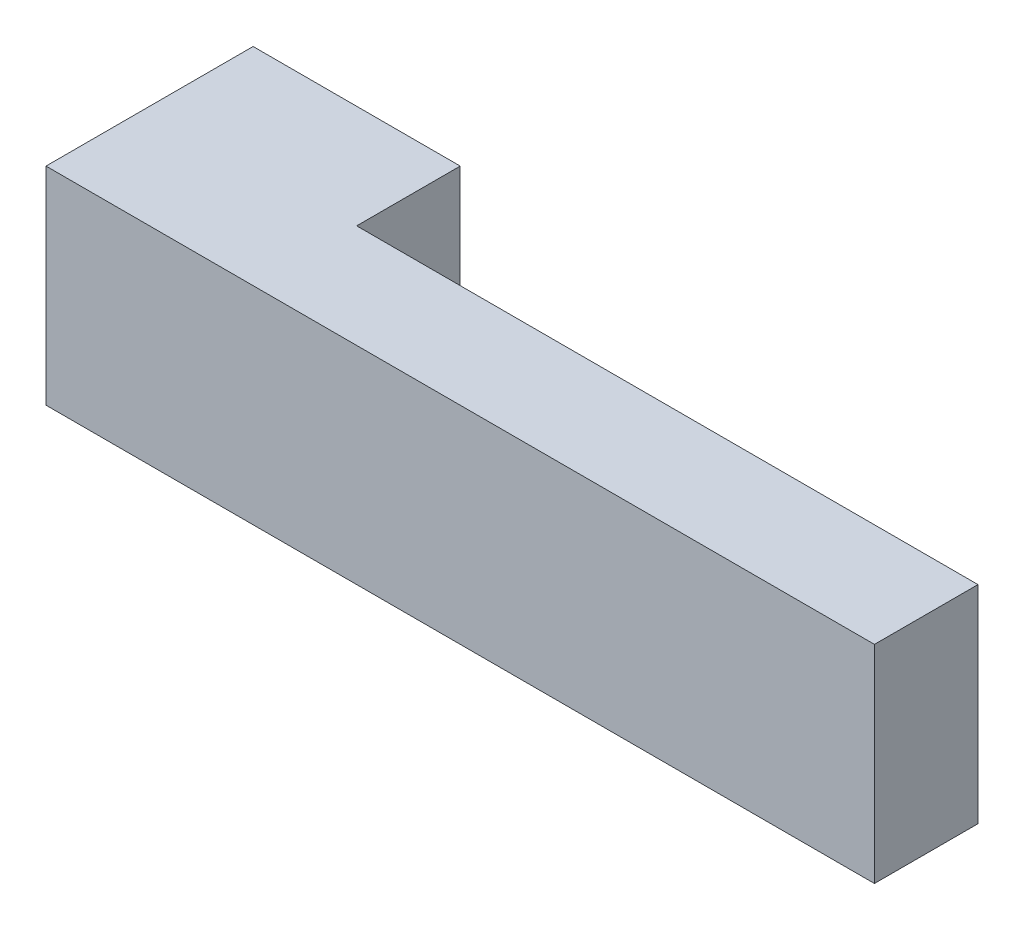
ISO-10303-21;
HEADER;
FILE_DESCRIPTION(('STEP AP214'),'2;1');
FILE_NAME('part.step','',(''),(''),'','','');
FILE_SCHEMA(('AUTOMOTIVE_DESIGN { 1 0 10303 214 1 1 1 1 }'));
ENDSEC;
DATA;
#1=APPLICATION_CONTEXT('core data for automotive mechanical design processes');
#2=APPLICATION_PROTOCOL_DEFINITION('international standard','automotive_design',2000,#1);
#3=PRODUCT_CONTEXT('',#1,'mechanical');
#4=PRODUCT('Part','Part','',(#3));
#5=PRODUCT_RELATED_PRODUCT_CATEGORY('part','',(#4));
#6=PRODUCT_DEFINITION_FORMATION('','',#4);
#7=PRODUCT_DEFINITION_CONTEXT('part definition',#1,'design');
#8=PRODUCT_DEFINITION('design','',#6,#7);
#9=PRODUCT_DEFINITION_SHAPE('','',#8);
#10=(LENGTH_UNIT() NAMED_UNIT(*) SI_UNIT(.MILLI.,.METRE.));
#11=(NAMED_UNIT(*) PLANE_ANGLE_UNIT() SI_UNIT($,.RADIAN.));
#12=(NAMED_UNIT(*) SI_UNIT($,.STERADIAN.) SOLID_ANGLE_UNIT());
#13=UNCERTAINTY_MEASURE_WITH_UNIT(LENGTH_MEASURE(1.E-05),#10,'distance_accuracy_value','');
#14=(GEOMETRIC_REPRESENTATION_CONTEXT(3) GLOBAL_UNCERTAINTY_ASSIGNED_CONTEXT((#13)) GLOBAL_UNIT_ASSIGNED_CONTEXT((#10,
#11,#12)) REPRESENTATION_CONTEXT('',''));
#15=CARTESIAN_POINT('',(0.,0.,0.));
#16=DIRECTION('',(0.,0.,1.));
#17=DIRECTION('',(1.,0.,0.));
#18=AXIS2_PLACEMENT_3D('',#15,#16,#17);
#19=CARTESIAN_POINT('',(80.,20.,20.));
#20=DIRECTION('',(-1.,0.,0.));
#21=DIRECTION('',(0.,0.,1.));
#22=AXIS2_PLACEMENT_3D('',#19,#20,#21);
#23=PLANE('',#22);
#24=DIRECTION('',(0.,0.,-1.));
#25=VECTOR('',#24,1.);
#26=CARTESIAN_POINT('',(80.,0.,20.));
#27=LINE('',#26,#25);
#28=CARTESIAN_POINT('',(80.,0.,20.));
#29=VERTEX_POINT('',#28);
#30=CARTESIAN_POINT('',(80.,0.,9.99999999999999));
#31=VERTEX_POINT('',#30);
#32=EDGE_CURVE('E128',#29,#31,#27,.T.);
#33=ORIENTED_EDGE('',*,*,#32,.T.);
#34=DIRECTION('',(0.,-1.,0.));
#35=VECTOR('',#34,1.);
#36=CARTESIAN_POINT('',(80.,20.,9.99999999999999));
#37=LINE('',#36,#35);
#38=CARTESIAN_POINT('',(80.,20.,9.99999999999999));
#39=VERTEX_POINT('',#38);
#40=EDGE_CURVE('E11',#39,#31,#37,.T.);
#41=ORIENTED_EDGE('',*,*,#40,.F.);
#42=DIRECTION('',(0.,0.,-1.));
#43=VECTOR('',#42,1.);
#44=CARTESIAN_POINT('',(80.,20.,20.));
#45=LINE('',#44,#43);
#46=CARTESIAN_POINT('',(80.,20.,20.));
#47=VERTEX_POINT('',#46);
#48=EDGE_CURVE('E144',#47,#39,#45,.T.);
#49=ORIENTED_EDGE('',*,*,#48,.F.);
#50=DIRECTION('',(0.,-1.,0.));
#51=VECTOR('',#50,1.);
#52=CARTESIAN_POINT('',(80.,20.,20.));
#53=LINE('',#52,#51);
#54=EDGE_CURVE('E124',#47,#29,#53,.T.);
#55=ORIENTED_EDGE('',*,*,#54,.T.);
#56=EDGE_LOOP('',(#33,#41,#49,#55));
#57=FACE_BOUND('',#56,.T.);
#58=ADVANCED_FACE('F39',(#57),#23,.F.);
#59=CARTESIAN_POINT('',(80.,20.,9.99999999999999));
#60=DIRECTION('',(0.,0.,1.));
#61=DIRECTION('',(1.,0.,0.));
#62=AXIS2_PLACEMENT_3D('',#59,#60,#61);
#63=PLANE('',#62);
#64=DIRECTION('',(-1.,0.,0.));
#65=VECTOR('',#64,1.);
#66=CARTESIAN_POINT('',(80.,0.,9.99999999999999));
#67=LINE('',#66,#65);
#68=CARTESIAN_POINT('',(20.,0.,10.));
#69=VERTEX_POINT('',#68);
#70=EDGE_CURVE('E132',#31,#69,#67,.T.);
#71=ORIENTED_EDGE('',*,*,#70,.T.);
#72=DIRECTION('',(0.,-1.,0.));
#73=VECTOR('',#72,1.);
#74=CARTESIAN_POINT('',(20.,20.,10.));
#75=LINE('',#74,#73);
#76=CARTESIAN_POINT('',(20.,20.,10.));
#77=VERTEX_POINT('',#76);
#78=EDGE_CURVE('E48',#77,#69,#75,.T.);
#79=ORIENTED_EDGE('',*,*,#78,.F.);
#80=DIRECTION('',(-1.,0.,0.));
#81=VECTOR('',#80,1.);
#82=CARTESIAN_POINT('',(80.,20.,9.99999999999999));
#83=LINE('',#82,#81);
#84=EDGE_CURVE('E93',#39,#77,#83,.T.);
#85=ORIENTED_EDGE('',*,*,#84,.F.);
#86=ORIENTED_EDGE('',*,*,#40,.T.);
#87=EDGE_LOOP('',(#71,#79,#85,#86));
#88=FACE_BOUND('',#87,.T.);
#89=ADVANCED_FACE('F172',(#88),#63,.F.);
#90=CARTESIAN_POINT('',(20.,20.,10.));
#91=DIRECTION('',(-1.,0.,0.));
#92=DIRECTION('',(0.,0.,1.));
#93=AXIS2_PLACEMENT_3D('',#90,#91,#92);
#94=PLANE('',#93);
#95=DIRECTION('',(0.,0.,-1.));
#96=VECTOR('',#95,1.);
#97=CARTESIAN_POINT('',(20.,0.,10.));
#98=LINE('',#97,#96);
#99=CARTESIAN_POINT('',(20.,0.,0.));
#100=VERTEX_POINT('',#99);
#101=EDGE_CURVE('E135',#69,#100,#98,.T.);
#102=ORIENTED_EDGE('',*,*,#101,.T.);
#103=DIRECTION('',(0.,-1.,0.));
#104=VECTOR('',#103,1.);
#105=CARTESIAN_POINT('',(20.,20.,0.));
#106=LINE('',#105,#104);
#107=CARTESIAN_POINT('',(20.,20.,0.));
#108=VERTEX_POINT('',#107);
#109=EDGE_CURVE('E117',#108,#100,#106,.T.);
#110=ORIENTED_EDGE('',*,*,#109,.F.);
#111=DIRECTION('',(0.,0.,-1.));
#112=VECTOR('',#111,1.);
#113=CARTESIAN_POINT('',(20.,20.,10.));
#114=LINE('',#113,#112);
#115=EDGE_CURVE('E106',#77,#108,#114,.T.);
#116=ORIENTED_EDGE('',*,*,#115,.F.);
#117=ORIENTED_EDGE('',*,*,#78,.T.);
#118=EDGE_LOOP('',(#102,#110,#116,#117));
#119=FACE_BOUND('',#118,.T.);
#120=ADVANCED_FACE('F154',(#119),#94,.F.);
#121=CARTESIAN_POINT('',(0.,20.,0.));
#122=DIRECTION('',(0.,0.,1.));
#123=DIRECTION('',(1.,0.,0.));
#124=AXIS2_PLACEMENT_3D('',#121,#122,#123);
#125=PLANE('',#124);
#126=DIRECTION('',(-1.,0.,0.));
#127=VECTOR('',#126,1.);
#128=CARTESIAN_POINT('',(0.,0.,0.));
#129=LINE('',#128,#127);
#130=CARTESIAN_POINT('',(0.,0.,0.));
#131=VERTEX_POINT('',#130);
#132=EDGE_CURVE('E115',#100,#131,#129,.T.);
#133=ORIENTED_EDGE('',*,*,#132,.T.);
#134=DIRECTION('',(0.,-1.,0.));
#135=VECTOR('',#134,1.);
#136=CARTESIAN_POINT('',(0.,20.,0.));
#137=LINE('',#136,#135);
#138=CARTESIAN_POINT('',(0.,20.,0.));
#139=VERTEX_POINT('',#138);
#140=EDGE_CURVE('E112',#139,#131,#137,.T.);
#141=ORIENTED_EDGE('',*,*,#140,.F.);
#142=DIRECTION('',(-1.,0.,0.));
#143=VECTOR('',#142,1.);
#144=CARTESIAN_POINT('',(0.,20.,0.));
#145=LINE('',#144,#143);
#146=EDGE_CURVE('E100',#108,#139,#145,.T.);
#147=ORIENTED_EDGE('',*,*,#146,.F.);
#148=ORIENTED_EDGE('',*,*,#109,.T.);
#149=EDGE_LOOP('',(#133,#141,#147,#148));
#150=FACE_BOUND('',#149,.T.);
#151=ADVANCED_FACE('F113',(#150),#125,.F.);
#152=CARTESIAN_POINT('',(0.,20.,20.));
#153=DIRECTION('',(1.,0.,0.));
#154=DIRECTION('',(0.,0.,-1.));
#155=AXIS2_PLACEMENT_3D('',#152,#153,#154);
#156=PLANE('',#155);
#157=DIRECTION('',(0.,0.,1.));
#158=VECTOR('',#157,1.);
#159=CARTESIAN_POINT('',(0.,0.,20.));
#160=LINE('',#159,#158);
#161=CARTESIAN_POINT('',(0.,0.,20.));
#162=VERTEX_POINT('',#161);
#163=EDGE_CURVE('E79',#131,#162,#160,.T.);
#164=ORIENTED_EDGE('',*,*,#163,.T.);
#165=DIRECTION('',(0.,-1.,0.));
#166=VECTOR('',#165,1.);
#167=CARTESIAN_POINT('',(0.,20.,20.));
#168=LINE('',#167,#166);
#169=CARTESIAN_POINT('',(0.,20.,20.));
#170=VERTEX_POINT('',#169);
#171=EDGE_CURVE('E118',#170,#162,#168,.T.);
#172=ORIENTED_EDGE('',*,*,#171,.F.);
#173=DIRECTION('',(0.,0.,1.));
#174=VECTOR('',#173,1.);
#175=CARTESIAN_POINT('',(0.,20.,20.));
#176=LINE('',#175,#174);
#177=EDGE_CURVE('E104',#139,#170,#176,.T.);
#178=ORIENTED_EDGE('',*,*,#177,.F.);
#179=ORIENTED_EDGE('',*,*,#140,.T.);
#180=EDGE_LOOP('',(#164,#172,#178,#179));
#181=FACE_BOUND('',#180,.T.);
#182=ADVANCED_FACE('F120',(#181),#156,.F.);
#183=CARTESIAN_POINT('',(80.,20.,20.));
#184=DIRECTION('',(0.,0.,-1.));
#185=DIRECTION('',(-1.,0.,0.));
#186=AXIS2_PLACEMENT_3D('',#183,#184,#185);
#187=PLANE('',#186);
#188=DIRECTION('',(1.,0.,0.));
#189=VECTOR('',#188,1.);
#190=CARTESIAN_POINT('',(80.,0.,20.));
#191=LINE('',#190,#189);
#192=EDGE_CURVE('E85',#162,#29,#191,.T.);
#193=ORIENTED_EDGE('',*,*,#192,.T.);
#194=ORIENTED_EDGE('',*,*,#54,.F.);
#195=DIRECTION('',(1.,0.,0.));
#196=VECTOR('',#195,1.);
#197=CARTESIAN_POINT('',(80.,20.,20.));
#198=LINE('',#197,#196);
#199=EDGE_CURVE('E56',#170,#47,#198,.T.);
#200=ORIENTED_EDGE('',*,*,#199,.F.);
#201=ORIENTED_EDGE('',*,*,#171,.T.);
#202=EDGE_LOOP('',(#193,#194,#200,#201));
#203=FACE_BOUND('',#202,.T.);
#204=ADVANCED_FACE('F161',(#203),#187,.F.);
#205=CARTESIAN_POINT('',(0.,20.,0.));
#206=DIRECTION('',(0.,1.,0.));
#207=DIRECTION('',(0.,0.,1.));
#208=AXIS2_PLACEMENT_3D('',#205,#206,#207);
#209=PLANE('',#208);
#210=ORIENTED_EDGE('',*,*,#48,.T.);
#211=ORIENTED_EDGE('',*,*,#84,.T.);
#212=ORIENTED_EDGE('',*,*,#115,.T.);
#213=ORIENTED_EDGE('',*,*,#146,.T.);
#214=ORIENTED_EDGE('',*,*,#177,.T.);
#215=ORIENTED_EDGE('',*,*,#199,.T.);
#216=EDGE_LOOP('',(#210,#211,#212,#213,#214,#215));
#217=FACE_BOUND('',#216,.T.);
#218=ADVANCED_FACE('F102',(#217),#209,.T.);
#219=CARTESIAN_POINT('',(0.,0.,0.));
#220=DIRECTION('',(0.,1.,0.));
#221=DIRECTION('',(0.,0.,1.));
#222=AXIS2_PLACEMENT_3D('',#219,#220,#221);
#223=PLANE('',#222);
#224=ORIENTED_EDGE('',*,*,#32,.F.);
#225=ORIENTED_EDGE('',*,*,#192,.F.);
#226=ORIENTED_EDGE('',*,*,#163,.F.);
#227=ORIENTED_EDGE('',*,*,#132,.F.);
#228=ORIENTED_EDGE('',*,*,#101,.F.);
#229=ORIENTED_EDGE('',*,*,#70,.F.);
#230=EDGE_LOOP('',(#224,#225,#226,#227,#228,#229));
#231=FACE_BOUND('',#230,.T.);
#232=ADVANCED_FACE('F157',(#231),#223,.F.);
#233=CLOSED_SHELL('',(#58,#89,#120,#151,#182,#204,#218,#232));
#234=MANIFOLD_SOLID_BREP('B2',#233);
#235=ADVANCED_BREP_SHAPE_REPRESENTATION('',(#18,#234),#14);
#236=SHAPE_DEFINITION_REPRESENTATION(#9,#235);
ENDSEC;
END-ISO-10303-21;
